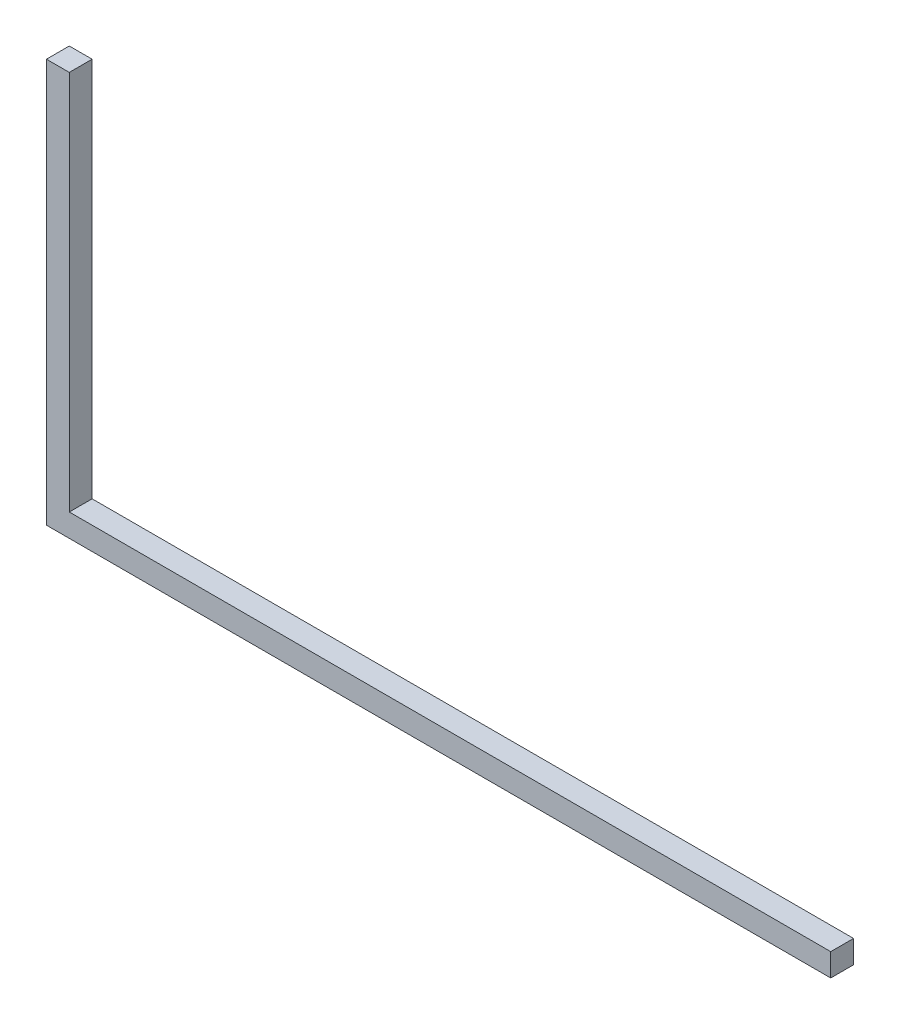
ISO-10303-21;
HEADER;
FILE_DESCRIPTION(('STEP AP214'),'2;1');
FILE_NAME('part.step','',(''),(''),'','','');
FILE_SCHEMA(('AUTOMOTIVE_DESIGN { 1 0 10303 214 1 1 1 1 }'));
ENDSEC;
DATA;
#1=APPLICATION_CONTEXT('core data for automotive mechanical design processes');
#2=APPLICATION_PROTOCOL_DEFINITION('international standard','automotive_design',2000,#1);
#3=PRODUCT_CONTEXT('',#1,'mechanical');
#4=PRODUCT('Part','Part','',(#3));
#5=PRODUCT_RELATED_PRODUCT_CATEGORY('part','',(#4));
#6=PRODUCT_DEFINITION_FORMATION('','',#4);
#7=PRODUCT_DEFINITION_CONTEXT('part definition',#1,'design');
#8=PRODUCT_DEFINITION('design','',#6,#7);
#9=PRODUCT_DEFINITION_SHAPE('','',#8);
#10=(LENGTH_UNIT() NAMED_UNIT(*) SI_UNIT(.MILLI.,.METRE.));
#11=(NAMED_UNIT(*) PLANE_ANGLE_UNIT() SI_UNIT($,.RADIAN.));
#12=(NAMED_UNIT(*) SI_UNIT($,.STERADIAN.) SOLID_ANGLE_UNIT());
#13=UNCERTAINTY_MEASURE_WITH_UNIT(LENGTH_MEASURE(1.E-05),#10,'distance_accuracy_value','');
#14=(GEOMETRIC_REPRESENTATION_CONTEXT(3) GLOBAL_UNCERTAINTY_ASSIGNED_CONTEXT((#13)) GLOBAL_UNIT_ASSIGNED_CONTEXT((#10,
#11,#12)) REPRESENTATION_CONTEXT('',''));
#15=CARTESIAN_POINT('',(0.,0.,0.));
#16=DIRECTION('',(0.,0.,1.));
#17=DIRECTION('',(1.,0.,0.));
#18=AXIS2_PLACEMENT_3D('',#15,#16,#17);
#19=CARTESIAN_POINT('',(500.,0.,15.));
#20=DIRECTION('',(0.,-1.,0.));
#21=DIRECTION('',(1.,0.,0.));
#22=AXIS2_PLACEMENT_3D('',#19,#20,#21);
#23=PLANE('',#22);
#24=DIRECTION('',(-1.,0.,0.));
#25=VECTOR('',#24,1.);
#26=CARTESIAN_POINT('',(500.,0.,0.));
#27=LINE('',#26,#25);
#28=CARTESIAN_POINT('',(500.,0.,0.));
#29=VERTEX_POINT('',#28);
#30=CARTESIAN_POINT('',(0.,0.,0.));
#31=VERTEX_POINT('',#30);
#32=EDGE_CURVE('E120',#29,#31,#27,.T.);
#33=ORIENTED_EDGE('',*,*,#32,.T.);
#34=DIRECTION('',(0.,0.,-1.));
#35=VECTOR('',#34,1.);
#36=CARTESIAN_POINT('',(0.,0.,15.));
#37=LINE('',#36,#35);
#38=CARTESIAN_POINT('',(0.,0.,15.));
#39=VERTEX_POINT('',#38);
#40=EDGE_CURVE('E11',#39,#31,#37,.T.);
#41=ORIENTED_EDGE('',*,*,#40,.F.);
#42=DIRECTION('',(-1.,0.,0.));
#43=VECTOR('',#42,1.);
#44=CARTESIAN_POINT('',(500.,0.,15.));
#45=LINE('',#44,#43);
#46=CARTESIAN_POINT('',(500.,0.,15.));
#47=VERTEX_POINT('',#46);
#48=EDGE_CURVE('E130',#47,#39,#45,.T.);
#49=ORIENTED_EDGE('',*,*,#48,.F.);
#50=DIRECTION('',(0.,0.,-1.));
#51=VECTOR('',#50,1.);
#52=CARTESIAN_POINT('',(500.,0.,15.));
#53=LINE('',#52,#51);
#54=EDGE_CURVE('E116',#47,#29,#53,.T.);
#55=ORIENTED_EDGE('',*,*,#54,.T.);
#56=EDGE_LOOP('',(#33,#41,#49,#55));
#57=FACE_BOUND('',#56,.T.);
#58=ADVANCED_FACE('F36',(#57),#23,.F.);
#59=CARTESIAN_POINT('',(0.,0.,15.));
#60=DIRECTION('',(-1.,0.,0.));
#61=DIRECTION('',(0.,0.,1.));
#62=AXIS2_PLACEMENT_3D('',#59,#60,#61);
#63=PLANE('',#62);
#64=DIRECTION('',(0.,1.,0.));
#65=VECTOR('',#64,1.);
#66=CARTESIAN_POINT('',(0.,0.,0.));
#67=LINE('',#66,#65);
#68=CARTESIAN_POINT('',(0.,250.,0.));
#69=VERTEX_POINT('',#68);
#70=EDGE_CURVE('E123',#31,#69,#67,.T.);
#71=ORIENTED_EDGE('',*,*,#70,.T.);
#72=DIRECTION('',(0.,0.,-1.));
#73=VECTOR('',#72,1.);
#74=CARTESIAN_POINT('',(0.,250.,15.));
#75=LINE('',#74,#73);
#76=CARTESIAN_POINT('',(0.,250.,15.));
#77=VERTEX_POINT('',#76);
#78=EDGE_CURVE('E44',#77,#69,#75,.T.);
#79=ORIENTED_EDGE('',*,*,#78,.F.);
#80=DIRECTION('',(0.,1.,0.));
#81=VECTOR('',#80,1.);
#82=CARTESIAN_POINT('',(0.,0.,15.));
#83=LINE('',#82,#81);
#84=EDGE_CURVE('E89',#39,#77,#83,.T.);
#85=ORIENTED_EDGE('',*,*,#84,.F.);
#86=ORIENTED_EDGE('',*,*,#40,.T.);
#87=EDGE_LOOP('',(#71,#79,#85,#86));
#88=FACE_BOUND('',#87,.T.);
#89=ADVANCED_FACE('F154',(#88),#63,.F.);
#90=CARTESIAN_POINT('',(0.,250.,15.));
#91=DIRECTION('',(0.,-1.,0.));
#92=DIRECTION('',(0.,0.,-1.));
#93=AXIS2_PLACEMENT_3D('',#90,#91,#92);
#94=PLANE('',#93);
#95=DIRECTION('',(-1.,0.,0.));
#96=VECTOR('',#95,1.);
#97=CARTESIAN_POINT('',(0.,250.,0.));
#98=LINE('',#97,#96);
#99=CARTESIAN_POINT('',(-15.,250.,0.));
#100=VERTEX_POINT('',#99);
#101=EDGE_CURVE('E125',#69,#100,#98,.T.);
#102=ORIENTED_EDGE('',*,*,#101,.T.);
#103=DIRECTION('',(0.,0.,-1.));
#104=VECTOR('',#103,1.);
#105=CARTESIAN_POINT('',(-15.,250.,15.));
#106=LINE('',#105,#104);
#107=CARTESIAN_POINT('',(-15.,250.,15.));
#108=VERTEX_POINT('',#107);
#109=EDGE_CURVE('E111',#108,#100,#106,.T.);
#110=ORIENTED_EDGE('',*,*,#109,.F.);
#111=DIRECTION('',(-1.,0.,0.));
#112=VECTOR('',#111,1.);
#113=CARTESIAN_POINT('',(0.,250.,15.));
#114=LINE('',#113,#112);
#115=EDGE_CURVE('E102',#77,#108,#114,.T.);
#116=ORIENTED_EDGE('',*,*,#115,.F.);
#117=ORIENTED_EDGE('',*,*,#78,.T.);
#118=EDGE_LOOP('',(#102,#110,#116,#117));
#119=FACE_BOUND('',#118,.T.);
#120=ADVANCED_FACE('F136',(#119),#94,.F.);
#121=CARTESIAN_POINT('',(-15.,250.,15.));
#122=DIRECTION('',(1.,0.,0.));
#123=DIRECTION('',(0.,1.,0.));
#124=AXIS2_PLACEMENT_3D('',#121,#122,#123);
#125=PLANE('',#124);
#126=DIRECTION('',(0.,-1.,0.));
#127=VECTOR('',#126,1.);
#128=CARTESIAN_POINT('',(-15.,250.,0.));
#129=LINE('',#128,#127);
#130=CARTESIAN_POINT('',(-15.,-15.,0.));
#131=VERTEX_POINT('',#130);
#132=EDGE_CURVE('E110',#100,#131,#129,.T.);
#133=ORIENTED_EDGE('',*,*,#132,.T.);
#134=DIRECTION('',(0.,0.,-1.));
#135=VECTOR('',#134,1.);
#136=CARTESIAN_POINT('',(-15.,-15.,15.));
#137=LINE('',#136,#135);
#138=CARTESIAN_POINT('',(-15.,-15.,15.));
#139=VERTEX_POINT('',#138);
#140=EDGE_CURVE('E107',#139,#131,#137,.T.);
#141=ORIENTED_EDGE('',*,*,#140,.F.);
#142=DIRECTION('',(0.,-1.,0.));
#143=VECTOR('',#142,1.);
#144=CARTESIAN_POINT('',(-15.,250.,15.));
#145=LINE('',#144,#143);
#146=EDGE_CURVE('E96',#108,#139,#145,.T.);
#147=ORIENTED_EDGE('',*,*,#146,.F.);
#148=ORIENTED_EDGE('',*,*,#109,.T.);
#149=EDGE_LOOP('',(#133,#141,#147,#148));
#150=FACE_BOUND('',#149,.T.);
#151=ADVANCED_FACE('F108',(#150),#125,.F.);
#152=CARTESIAN_POINT('',(-15.,-15.,15.));
#153=DIRECTION('',(0.,1.,0.));
#154=DIRECTION('',(-1.,0.,0.));
#155=AXIS2_PLACEMENT_3D('',#152,#153,#154);
#156=PLANE('',#155);
#157=DIRECTION('',(1.,0.,0.));
#158=VECTOR('',#157,1.);
#159=CARTESIAN_POINT('',(-15.,-15.,0.));
#160=LINE('',#159,#158);
#161=CARTESIAN_POINT('',(500.,-14.9999999999999,0.));
#162=VERTEX_POINT('',#161);
#163=EDGE_CURVE('E75',#131,#162,#160,.T.);
#164=ORIENTED_EDGE('',*,*,#163,.T.);
#165=DIRECTION('',(0.,0.,-1.));
#166=VECTOR('',#165,1.);
#167=CARTESIAN_POINT('',(500.,-14.9999999999999,15.));
#168=LINE('',#167,#166);
#169=CARTESIAN_POINT('',(500.,-14.9999999999999,15.));
#170=VERTEX_POINT('',#169);
#171=EDGE_CURVE('E112',#170,#162,#168,.T.);
#172=ORIENTED_EDGE('',*,*,#171,.F.);
#173=DIRECTION('',(1.,0.,0.));
#174=VECTOR('',#173,1.);
#175=CARTESIAN_POINT('',(-15.,-15.,15.));
#176=LINE('',#175,#174);
#177=EDGE_CURVE('E100',#139,#170,#176,.T.);
#178=ORIENTED_EDGE('',*,*,#177,.F.);
#179=ORIENTED_EDGE('',*,*,#140,.T.);
#180=EDGE_LOOP('',(#164,#172,#178,#179));
#181=FACE_BOUND('',#180,.T.);
#182=ADVANCED_FACE('F114',(#181),#156,.F.);
#183=CARTESIAN_POINT('',(500.,-14.9999999999999,15.));
#184=DIRECTION('',(-1.,0.,0.));
#185=DIRECTION('',(0.,0.,1.));
#186=AXIS2_PLACEMENT_3D('',#183,#184,#185);
#187=PLANE('',#186);
#188=DIRECTION('',(0.,1.,0.));
#189=VECTOR('',#188,1.);
#190=CARTESIAN_POINT('',(500.,-14.9999999999999,0.));
#191=LINE('',#190,#189);
#192=EDGE_CURVE('E81',#162,#29,#191,.T.);
#193=ORIENTED_EDGE('',*,*,#192,.T.);
#194=ORIENTED_EDGE('',*,*,#54,.F.);
#195=DIRECTION('',(0.,1.,0.));
#196=VECTOR('',#195,1.);
#197=CARTESIAN_POINT('',(500.,-14.9999999999999,15.));
#198=LINE('',#197,#196);
#199=EDGE_CURVE('E52',#170,#47,#198,.T.);
#200=ORIENTED_EDGE('',*,*,#199,.F.);
#201=ORIENTED_EDGE('',*,*,#171,.T.);
#202=EDGE_LOOP('',(#193,#194,#200,#201));
#203=FACE_BOUND('',#202,.T.);
#204=ADVANCED_FACE('F143',(#203),#187,.F.);
#205=CARTESIAN_POINT('',(0.,0.,15.));
#206=DIRECTION('',(0.,0.,-1.));
#207=DIRECTION('',(-1.,0.,0.));
#208=AXIS2_PLACEMENT_3D('',#205,#206,#207);
#209=PLANE('',#208);
#210=ORIENTED_EDGE('',*,*,#48,.T.);
#211=ORIENTED_EDGE('',*,*,#84,.T.);
#212=ORIENTED_EDGE('',*,*,#115,.T.);
#213=ORIENTED_EDGE('',*,*,#146,.T.);
#214=ORIENTED_EDGE('',*,*,#177,.T.);
#215=ORIENTED_EDGE('',*,*,#199,.T.);
#216=EDGE_LOOP('',(#210,#211,#212,#213,#214,#215));
#217=FACE_BOUND('',#216,.T.);
#218=ADVANCED_FACE('F98',(#217),#209,.F.);
#219=CARTESIAN_POINT('',(0.,0.,0.));
#220=DIRECTION('',(0.,0.,-1.));
#221=DIRECTION('',(-1.,0.,0.));
#222=AXIS2_PLACEMENT_3D('',#219,#220,#221);
#223=PLANE('',#222);
#224=ORIENTED_EDGE('',*,*,#32,.F.);
#225=ORIENTED_EDGE('',*,*,#192,.F.);
#226=ORIENTED_EDGE('',*,*,#163,.F.);
#227=ORIENTED_EDGE('',*,*,#132,.F.);
#228=ORIENTED_EDGE('',*,*,#101,.F.);
#229=ORIENTED_EDGE('',*,*,#70,.F.);
#230=EDGE_LOOP('',(#224,#225,#226,#227,#228,#229));
#231=FACE_BOUND('',#230,.T.);
#232=ADVANCED_FACE('F139',(#231),#223,.T.);
#233=CLOSED_SHELL('',(#58,#89,#120,#151,#182,#204,#218,#232));
#234=MANIFOLD_SOLID_BREP('B2',#233);
#235=ADVANCED_BREP_SHAPE_REPRESENTATION('',(#18,#234),#14);
#236=SHAPE_DEFINITION_REPRESENTATION(#9,#235);
ENDSEC;
END-ISO-10303-21;
